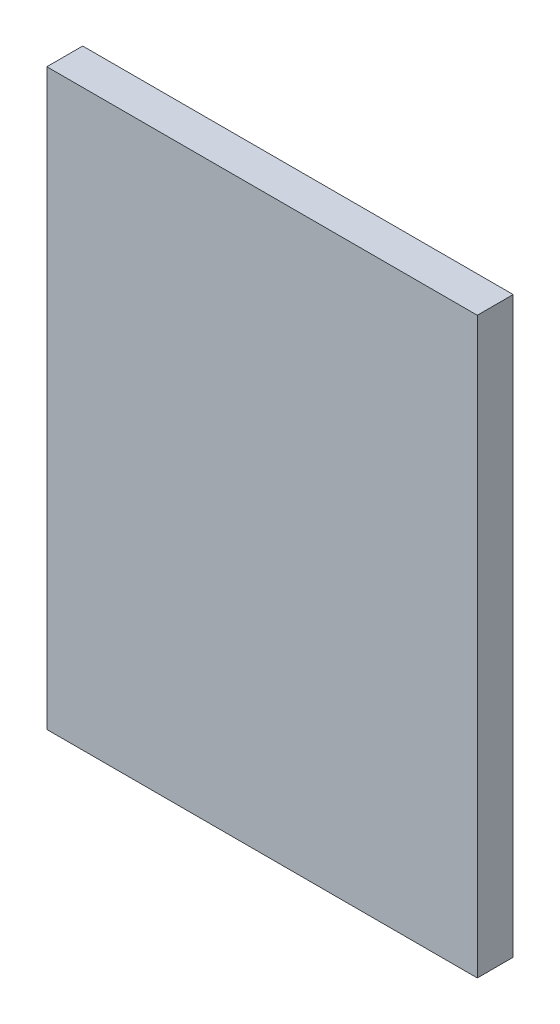
ISO-10303-21;
HEADER;
FILE_DESCRIPTION(('STEP AP214'),'2;1');
FILE_NAME('part.step','',(''),(''),'','','');
FILE_SCHEMA(('AUTOMOTIVE_DESIGN { 1 0 10303 214 1 1 1 1 }'));
ENDSEC;
DATA;
#1=APPLICATION_CONTEXT('core data for automotive mechanical design processes');
#2=APPLICATION_PROTOCOL_DEFINITION('international standard','automotive_design',2000,#1);
#3=PRODUCT_CONTEXT('',#1,'mechanical');
#4=PRODUCT('Part','Part','',(#3));
#5=PRODUCT_RELATED_PRODUCT_CATEGORY('part','',(#4));
#6=PRODUCT_DEFINITION_FORMATION('','',#4);
#7=PRODUCT_DEFINITION_CONTEXT('part definition',#1,'design');
#8=PRODUCT_DEFINITION('design','',#6,#7);
#9=PRODUCT_DEFINITION_SHAPE('','',#8);
#10=(LENGTH_UNIT() NAMED_UNIT(*) SI_UNIT(.MILLI.,.METRE.));
#11=(NAMED_UNIT(*) PLANE_ANGLE_UNIT() SI_UNIT($,.RADIAN.));
#12=(NAMED_UNIT(*) SI_UNIT($,.STERADIAN.) SOLID_ANGLE_UNIT());
#13=UNCERTAINTY_MEASURE_WITH_UNIT(LENGTH_MEASURE(1.E-05),#10,'distance_accuracy_value','');
#14=(GEOMETRIC_REPRESENTATION_CONTEXT(3) GLOBAL_UNCERTAINTY_ASSIGNED_CONTEXT((#13)) GLOBAL_UNIT_ASSIGNED_CONTEXT((#10,
#11,#12)) REPRESENTATION_CONTEXT('',''));
#15=CARTESIAN_POINT('',(0.,0.,0.));
#16=DIRECTION('',(0.,0.,1.));
#17=DIRECTION('',(1.,0.,0.));
#18=AXIS2_PLACEMENT_3D('',#15,#16,#17);
#19=CARTESIAN_POINT('',(914.4,-1219.2,152.4));
#20=DIRECTION('',(-1.,0.,0.));
#21=DIRECTION('',(0.,0.,1.));
#22=AXIS2_PLACEMENT_3D('',#19,#20,#21);
#23=PLANE('',#22);
#24=DIRECTION('',(0.,1.,0.));
#25=VECTOR('',#24,1.);
#26=CARTESIAN_POINT('',(914.4,-1219.2,0.));
#27=LINE('',#26,#25);
#28=CARTESIAN_POINT('',(914.4,-1219.2,0.));
#29=VERTEX_POINT('',#28);
#30=CARTESIAN_POINT('',(914.4,1219.2,0.));
#31=VERTEX_POINT('',#30);
#32=EDGE_CURVE('E107',#29,#31,#27,.T.);
#33=ORIENTED_EDGE('',*,*,#32,.T.);
#34=DIRECTION('',(0.,0.,-1.));
#35=VECTOR('',#34,1.);
#36=CARTESIAN_POINT('',(914.4,1219.2,152.4));
#37=LINE('',#36,#35);
#38=CARTESIAN_POINT('',(914.4,1219.2,152.4));
#39=VERTEX_POINT('',#38);
#40=EDGE_CURVE('E11',#39,#31,#37,.T.);
#41=ORIENTED_EDGE('',*,*,#40,.F.);
#42=DIRECTION('',(0.,1.,0.));
#43=VECTOR('',#42,1.);
#44=CARTESIAN_POINT('',(914.4,-1219.2,152.4));
#45=LINE('',#44,#43);
#46=CARTESIAN_POINT('',(914.4,-1219.2,152.4));
#47=VERTEX_POINT('',#46);
#48=EDGE_CURVE('E91',#47,#39,#45,.T.);
#49=ORIENTED_EDGE('',*,*,#48,.F.);
#50=DIRECTION('',(0.,0.,-1.));
#51=VECTOR('',#50,1.);
#52=CARTESIAN_POINT('',(914.4,-1219.2,152.4));
#53=LINE('',#52,#51);
#54=EDGE_CURVE('E103',#47,#29,#53,.T.);
#55=ORIENTED_EDGE('',*,*,#54,.T.);
#56=EDGE_LOOP('',(#33,#41,#49,#55));
#57=FACE_BOUND('',#56,.T.);
#58=ADVANCED_FACE('F39',(#57),#23,.F.);
#59=CARTESIAN_POINT('',(-914.4,1219.2,152.4));
#60=DIRECTION('',(0.,-1.,0.));
#61=DIRECTION('',(0.,0.,-1.));
#62=AXIS2_PLACEMENT_3D('',#59,#60,#61);
#63=PLANE('',#62);
#64=DIRECTION('',(-1.,0.,0.));
#65=VECTOR('',#64,1.);
#66=CARTESIAN_POINT('',(-914.4,1219.2,0.));
#67=LINE('',#66,#65);
#68=CARTESIAN_POINT('',(-914.4,1219.2,0.));
#69=VERTEX_POINT('',#68);
#70=EDGE_CURVE('E96',#31,#69,#67,.T.);
#71=ORIENTED_EDGE('',*,*,#70,.T.);
#72=DIRECTION('',(0.,0.,-1.));
#73=VECTOR('',#72,1.);
#74=CARTESIAN_POINT('',(-914.4,1219.2,152.4));
#75=LINE('',#74,#73);
#76=CARTESIAN_POINT('',(-914.4,1219.2,152.4));
#77=VERTEX_POINT('',#76);
#78=EDGE_CURVE('E48',#77,#69,#75,.T.);
#79=ORIENTED_EDGE('',*,*,#78,.F.);
#80=DIRECTION('',(-1.,0.,0.));
#81=VECTOR('',#80,1.);
#82=CARTESIAN_POINT('',(-914.4,1219.2,152.4));
#83=LINE('',#82,#81);
#84=EDGE_CURVE('E86',#39,#77,#83,.T.);
#85=ORIENTED_EDGE('',*,*,#84,.F.);
#86=ORIENTED_EDGE('',*,*,#40,.T.);
#87=EDGE_LOOP('',(#71,#79,#85,#86));
#88=FACE_BOUND('',#87,.T.);
#89=ADVANCED_FACE('F95',(#88),#63,.F.);
#90=CARTESIAN_POINT('',(-914.4,-1219.2,152.4));
#91=DIRECTION('',(1.,0.,0.));
#92=DIRECTION('',(0.,0.,-1.));
#93=AXIS2_PLACEMENT_3D('',#90,#91,#92);
#94=PLANE('',#93);
#95=DIRECTION('',(0.,-1.,0.));
#96=VECTOR('',#95,1.);
#97=CARTESIAN_POINT('',(-914.4,-1219.2,0.));
#98=LINE('',#97,#96);
#99=CARTESIAN_POINT('',(-914.4,-1219.2,0.));
#100=VERTEX_POINT('',#99);
#101=EDGE_CURVE('E73',#69,#100,#98,.T.);
#102=ORIENTED_EDGE('',*,*,#101,.T.);
#103=DIRECTION('',(0.,0.,-1.));
#104=VECTOR('',#103,1.);
#105=CARTESIAN_POINT('',(-914.4,-1219.2,152.4));
#106=LINE('',#105,#104);
#107=CARTESIAN_POINT('',(-914.4,-1219.2,152.4));
#108=VERTEX_POINT('',#107);
#109=EDGE_CURVE('E98',#108,#100,#106,.T.);
#110=ORIENTED_EDGE('',*,*,#109,.F.);
#111=DIRECTION('',(0.,-1.,0.));
#112=VECTOR('',#111,1.);
#113=CARTESIAN_POINT('',(-914.4,-1219.2,152.4));
#114=LINE('',#113,#112);
#115=EDGE_CURVE('E89',#77,#108,#114,.T.);
#116=ORIENTED_EDGE('',*,*,#115,.F.);
#117=ORIENTED_EDGE('',*,*,#78,.T.);
#118=EDGE_LOOP('',(#102,#110,#116,#117));
#119=FACE_BOUND('',#118,.T.);
#120=ADVANCED_FACE('F99',(#119),#94,.F.);
#121=CARTESIAN_POINT('',(-914.4,-1219.2,152.4));
#122=DIRECTION('',(0.,1.,0.));
#123=DIRECTION('',(0.,0.,1.));
#124=AXIS2_PLACEMENT_3D('',#121,#122,#123);
#125=PLANE('',#124);
#126=DIRECTION('',(1.,0.,0.));
#127=VECTOR('',#126,1.);
#128=CARTESIAN_POINT('',(-914.4,-1219.2,0.));
#129=LINE('',#128,#127);
#130=EDGE_CURVE('E79',#100,#29,#129,.T.);
#131=ORIENTED_EDGE('',*,*,#130,.T.);
#132=ORIENTED_EDGE('',*,*,#54,.F.);
#133=DIRECTION('',(1.,0.,0.));
#134=VECTOR('',#133,1.);
#135=CARTESIAN_POINT('',(-914.4,-1219.2,152.4));
#136=LINE('',#135,#134);
#137=EDGE_CURVE('E56',#108,#47,#136,.T.);
#138=ORIENTED_EDGE('',*,*,#137,.F.);
#139=ORIENTED_EDGE('',*,*,#109,.T.);
#140=EDGE_LOOP('',(#131,#132,#138,#139));
#141=FACE_BOUND('',#140,.T.);
#142=ADVANCED_FACE('F120',(#141),#125,.F.);
#143=CARTESIAN_POINT('',(0.,0.,152.4));
#144=DIRECTION('',(0.,0.,-1.));
#145=DIRECTION('',(-1.,0.,0.));
#146=AXIS2_PLACEMENT_3D('',#143,#144,#145);
#147=PLANE('',#146);
#148=ORIENTED_EDGE('',*,*,#48,.T.);
#149=ORIENTED_EDGE('',*,*,#84,.T.);
#150=ORIENTED_EDGE('',*,*,#115,.T.);
#151=ORIENTED_EDGE('',*,*,#137,.T.);
#152=EDGE_LOOP('',(#148,#149,#150,#151));
#153=FACE_BOUND('',#152,.T.);
#154=ADVANCED_FACE('F87',(#153),#147,.F.);
#155=CARTESIAN_POINT('',(0.,0.,0.));
#156=DIRECTION('',(0.,0.,-1.));
#157=DIRECTION('',(-1.,0.,0.));
#158=AXIS2_PLACEMENT_3D('',#155,#156,#157);
#159=PLANE('',#158);
#160=ORIENTED_EDGE('',*,*,#32,.F.);
#161=ORIENTED_EDGE('',*,*,#130,.F.);
#162=ORIENTED_EDGE('',*,*,#101,.F.);
#163=ORIENTED_EDGE('',*,*,#70,.F.);
#164=EDGE_LOOP('',(#160,#161,#162,#163));
#165=FACE_BOUND('',#164,.T.);
#166=ADVANCED_FACE('F123',(#165),#159,.T.);
#167=CLOSED_SHELL('',(#58,#89,#120,#142,#154,#166));
#168=MANIFOLD_SOLID_BREP('B2',#167);
#169=ADVANCED_BREP_SHAPE_REPRESENTATION('',(#18,#168),#14);
#170=SHAPE_DEFINITION_REPRESENTATION(#9,#169);
ENDSEC;
END-ISO-10303-21;
